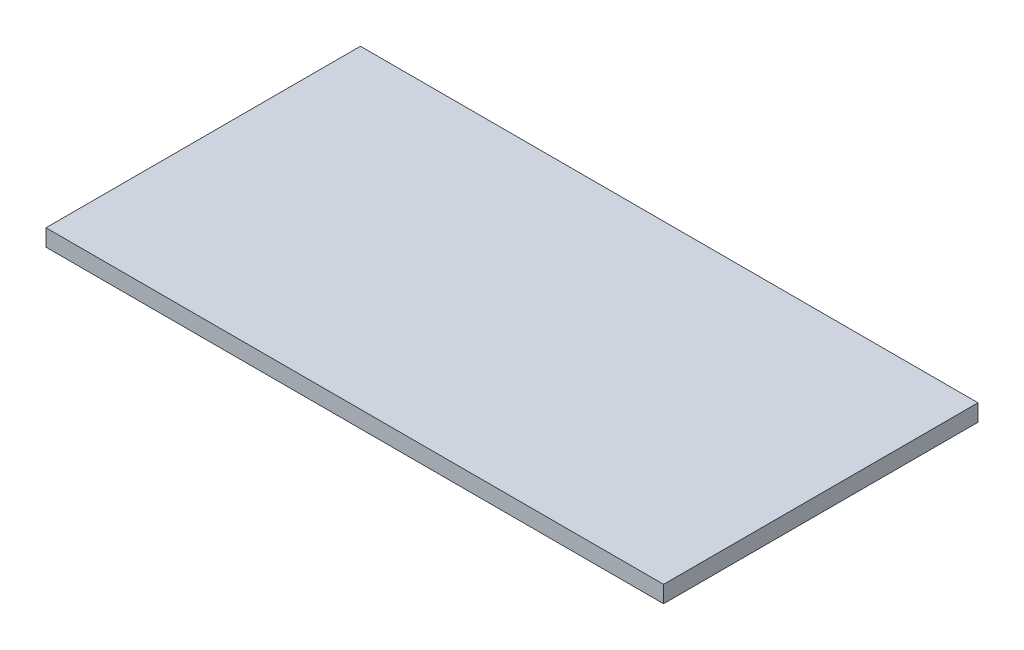
ISO-10303-21;
HEADER;
FILE_DESCRIPTION(('STEP AP214'),'2;1');
FILE_NAME('part.step','',(''),(''),'','','');
FILE_SCHEMA(('AUTOMOTIVE_DESIGN { 1 0 10303 214 1 1 1 1 }'));
ENDSEC;
DATA;
#1=APPLICATION_CONTEXT('core data for automotive mechanical design processes');
#2=APPLICATION_PROTOCOL_DEFINITION('international standard','automotive_design',2000,#1);
#3=PRODUCT_CONTEXT('',#1,'mechanical');
#4=PRODUCT('Part','Part','',(#3));
#5=PRODUCT_RELATED_PRODUCT_CATEGORY('part','',(#4));
#6=PRODUCT_DEFINITION_FORMATION('','',#4);
#7=PRODUCT_DEFINITION_CONTEXT('part definition',#1,'design');
#8=PRODUCT_DEFINITION('design','',#6,#7);
#9=PRODUCT_DEFINITION_SHAPE('','',#8);
#10=(LENGTH_UNIT() NAMED_UNIT(*) SI_UNIT(.MILLI.,.METRE.));
#11=(NAMED_UNIT(*) PLANE_ANGLE_UNIT() SI_UNIT($,.RADIAN.));
#12=(NAMED_UNIT(*) SI_UNIT($,.STERADIAN.) SOLID_ANGLE_UNIT());
#13=UNCERTAINTY_MEASURE_WITH_UNIT(LENGTH_MEASURE(1.E-05),#10,'distance_accuracy_value','');
#14=(GEOMETRIC_REPRESENTATION_CONTEXT(3) GLOBAL_UNCERTAINTY_ASSIGNED_CONTEXT((#13)) GLOBAL_UNIT_ASSIGNED_CONTEXT((#10,
#11,#12)) REPRESENTATION_CONTEXT('',''));
#15=CARTESIAN_POINT('',(0.,0.,0.));
#16=DIRECTION('',(0.,0.,1.));
#17=DIRECTION('',(1.,0.,0.));
#18=AXIS2_PLACEMENT_3D('',#15,#16,#17);
#19=CARTESIAN_POINT('',(-90.0205065484903,6.,-49.908056678603));
#20=DIRECTION('',(1.,0.,0.));
#21=DIRECTION('',(0.,0.,-1.));
#22=AXIS2_PLACEMENT_3D('',#19,#20,#21);
#23=PLANE('',#22);
#24=DIRECTION('',(0.,0.,1.));
#25=VECTOR('',#24,1.);
#26=CARTESIAN_POINT('',(-90.0205065484903,0.,-49.908056678603));
#27=LINE('',#26,#25);
#28=CARTESIAN_POINT('',(-90.0205065484903,0.,-49.908056678603));
#29=VERTEX_POINT('',#28);
#30=CARTESIAN_POINT('',(-90.0205065484903,0.,62.091943321397));
#31=VERTEX_POINT('',#30);
#32=EDGE_CURVE('E96',#29,#31,#27,.T.);
#33=ORIENTED_EDGE('',*,*,#32,.T.);
#34=DIRECTION('',(0.,-1.,0.));
#35=VECTOR('',#34,1.);
#36=CARTESIAN_POINT('',(-90.0205065484903,6.,62.091943321397));
#37=LINE('',#36,#35);
#38=CARTESIAN_POINT('',(-90.0205065484903,6.,62.091943321397));
#39=VERTEX_POINT('',#38);
#40=EDGE_CURVE('E11',#39,#31,#37,.T.);
#41=ORIENTED_EDGE('',*,*,#40,.F.);
#42=DIRECTION('',(0.,0.,1.));
#43=VECTOR('',#42,1.);
#44=CARTESIAN_POINT('',(-90.0205065484903,6.,-49.908056678603));
#45=LINE('',#44,#43);
#46=CARTESIAN_POINT('',(-90.0205065484903,6.,-49.908056678603));
#47=VERTEX_POINT('',#46);
#48=EDGE_CURVE('E84',#47,#39,#45,.T.);
#49=ORIENTED_EDGE('',*,*,#48,.F.);
#50=DIRECTION('',(0.,-1.,0.));
#51=VECTOR('',#50,1.);
#52=CARTESIAN_POINT('',(-90.0205065484903,6.,-49.908056678603));
#53=LINE('',#52,#51);
#54=EDGE_CURVE('E92',#47,#29,#53,.T.);
#55=ORIENTED_EDGE('',*,*,#54,.T.);
#56=EDGE_LOOP('',(#33,#41,#49,#55));
#57=FACE_BOUND('',#56,.T.);
#58=ADVANCED_FACE('F33',(#57),#23,.F.);
#59=CARTESIAN_POINT('',(-90.0205065484903,6.,62.091943321397));
#60=DIRECTION('',(0.,0.,-1.));
#61=DIRECTION('',(-1.,0.,0.));
#62=AXIS2_PLACEMENT_3D('',#59,#60,#61);
#63=PLANE('',#62);
#64=DIRECTION('',(1.,0.,0.));
#65=VECTOR('',#64,1.);
#66=CARTESIAN_POINT('',(-90.0205065484903,0.,62.091943321397));
#67=LINE('',#66,#65);
#68=CARTESIAN_POINT('',(129.97949345151,0.,62.091943321397));
#69=VERTEX_POINT('',#68);
#70=EDGE_CURVE('E88',#31,#69,#67,.T.);
#71=ORIENTED_EDGE('',*,*,#70,.T.);
#72=DIRECTION('',(0.,-1.,0.));
#73=VECTOR('',#72,1.);
#74=CARTESIAN_POINT('',(129.97949345151,6.,62.091943321397));
#75=LINE('',#74,#73);
#76=CARTESIAN_POINT('',(129.97949345151,6.,62.091943321397));
#77=VERTEX_POINT('',#76);
#78=EDGE_CURVE('E41',#77,#69,#75,.T.);
#79=ORIENTED_EDGE('',*,*,#78,.F.);
#80=DIRECTION('',(1.,0.,0.));
#81=VECTOR('',#80,1.);
#82=CARTESIAN_POINT('',(-90.0205065484903,6.,62.091943321397));
#83=LINE('',#82,#81);
#84=EDGE_CURVE('E79',#39,#77,#83,.T.);
#85=ORIENTED_EDGE('',*,*,#84,.F.);
#86=ORIENTED_EDGE('',*,*,#40,.T.);
#87=EDGE_LOOP('',(#71,#79,#85,#86));
#88=FACE_BOUND('',#87,.T.);
#89=ADVANCED_FACE('F87',(#88),#63,.F.);
#90=CARTESIAN_POINT('',(129.97949345151,6.,-49.908056678603));
#91=DIRECTION('',(-1.,0.,0.));
#92=DIRECTION('',(0.,0.,1.));
#93=AXIS2_PLACEMENT_3D('',#90,#91,#92);
#94=PLANE('',#93);
#95=DIRECTION('',(0.,0.,-1.));
#96=VECTOR('',#95,1.);
#97=CARTESIAN_POINT('',(129.97949345151,0.,-49.908056678603));
#98=LINE('',#97,#96);
#99=CARTESIAN_POINT('',(129.97949345151,0.,-49.908056678603));
#100=VERTEX_POINT('',#99);
#101=EDGE_CURVE('E66',#69,#100,#98,.T.);
#102=ORIENTED_EDGE('',*,*,#101,.T.);
#103=DIRECTION('',(0.,-1.,0.));
#104=VECTOR('',#103,1.);
#105=CARTESIAN_POINT('',(129.97949345151,6.,-49.908056678603));
#106=LINE('',#105,#104);
#107=CARTESIAN_POINT('',(129.97949345151,6.,-49.908056678603));
#108=VERTEX_POINT('',#107);
#109=EDGE_CURVE('E89',#108,#100,#106,.T.);
#110=ORIENTED_EDGE('',*,*,#109,.F.);
#111=DIRECTION('',(0.,0.,-1.));
#112=VECTOR('',#111,1.);
#113=CARTESIAN_POINT('',(129.97949345151,6.,-49.908056678603));
#114=LINE('',#113,#112);
#115=EDGE_CURVE('E82',#77,#108,#114,.T.);
#116=ORIENTED_EDGE('',*,*,#115,.F.);
#117=ORIENTED_EDGE('',*,*,#78,.T.);
#118=EDGE_LOOP('',(#102,#110,#116,#117));
#119=FACE_BOUND('',#118,.T.);
#120=ADVANCED_FACE('F90',(#119),#94,.F.);
#121=CARTESIAN_POINT('',(-90.0205065484903,6.,-49.908056678603));
#122=DIRECTION('',(0.,0.,1.));
#123=DIRECTION('',(1.,0.,0.));
#124=AXIS2_PLACEMENT_3D('',#121,#122,#123);
#125=PLANE('',#124);
#126=DIRECTION('',(-1.,0.,0.));
#127=VECTOR('',#126,1.);
#128=CARTESIAN_POINT('',(-90.0205065484903,0.,-49.908056678603));
#129=LINE('',#128,#127);
#130=EDGE_CURVE('E72',#100,#29,#129,.T.);
#131=ORIENTED_EDGE('',*,*,#130,.T.);
#132=ORIENTED_EDGE('',*,*,#54,.F.);
#133=DIRECTION('',(-1.,0.,0.));
#134=VECTOR('',#133,1.);
#135=CARTESIAN_POINT('',(-90.0205065484903,6.,-49.908056678603));
#136=LINE('',#135,#134);
#137=EDGE_CURVE('E49',#108,#47,#136,.T.);
#138=ORIENTED_EDGE('',*,*,#137,.F.);
#139=ORIENTED_EDGE('',*,*,#109,.T.);
#140=EDGE_LOOP('',(#131,#132,#138,#139));
#141=FACE_BOUND('',#140,.T.);
#142=ADVANCED_FACE('F103',(#141),#125,.F.);
#143=CARTESIAN_POINT('',(0.,6.,0.));
#144=DIRECTION('',(0.,1.,0.));
#145=DIRECTION('',(0.,0.,1.));
#146=AXIS2_PLACEMENT_3D('',#143,#144,#145);
#147=PLANE('',#146);
#148=ORIENTED_EDGE('',*,*,#48,.T.);
#149=ORIENTED_EDGE('',*,*,#84,.T.);
#150=ORIENTED_EDGE('',*,*,#115,.T.);
#151=ORIENTED_EDGE('',*,*,#137,.T.);
#152=EDGE_LOOP('',(#148,#149,#150,#151));
#153=FACE_BOUND('',#152,.T.);
#154=ADVANCED_FACE('F80',(#153),#147,.T.);
#155=CARTESIAN_POINT('',(0.,0.,0.));
#156=DIRECTION('',(0.,1.,0.));
#157=DIRECTION('',(0.,0.,1.));
#158=AXIS2_PLACEMENT_3D('',#155,#156,#157);
#159=PLANE('',#158);
#160=ORIENTED_EDGE('',*,*,#32,.F.);
#161=ORIENTED_EDGE('',*,*,#130,.F.);
#162=ORIENTED_EDGE('',*,*,#101,.F.);
#163=ORIENTED_EDGE('',*,*,#70,.F.);
#164=EDGE_LOOP('',(#160,#161,#162,#163));
#165=FACE_BOUND('',#164,.T.);
#166=ADVANCED_FACE('F106',(#165),#159,.F.);
#167=CLOSED_SHELL('',(#58,#89,#120,#142,#154,#166));
#168=MANIFOLD_SOLID_BREP('B2',#167);
#169=ADVANCED_BREP_SHAPE_REPRESENTATION('',(#18,#168),#14);
#170=SHAPE_DEFINITION_REPRESENTATION(#9,#169);
ENDSEC;
END-ISO-10303-21;
